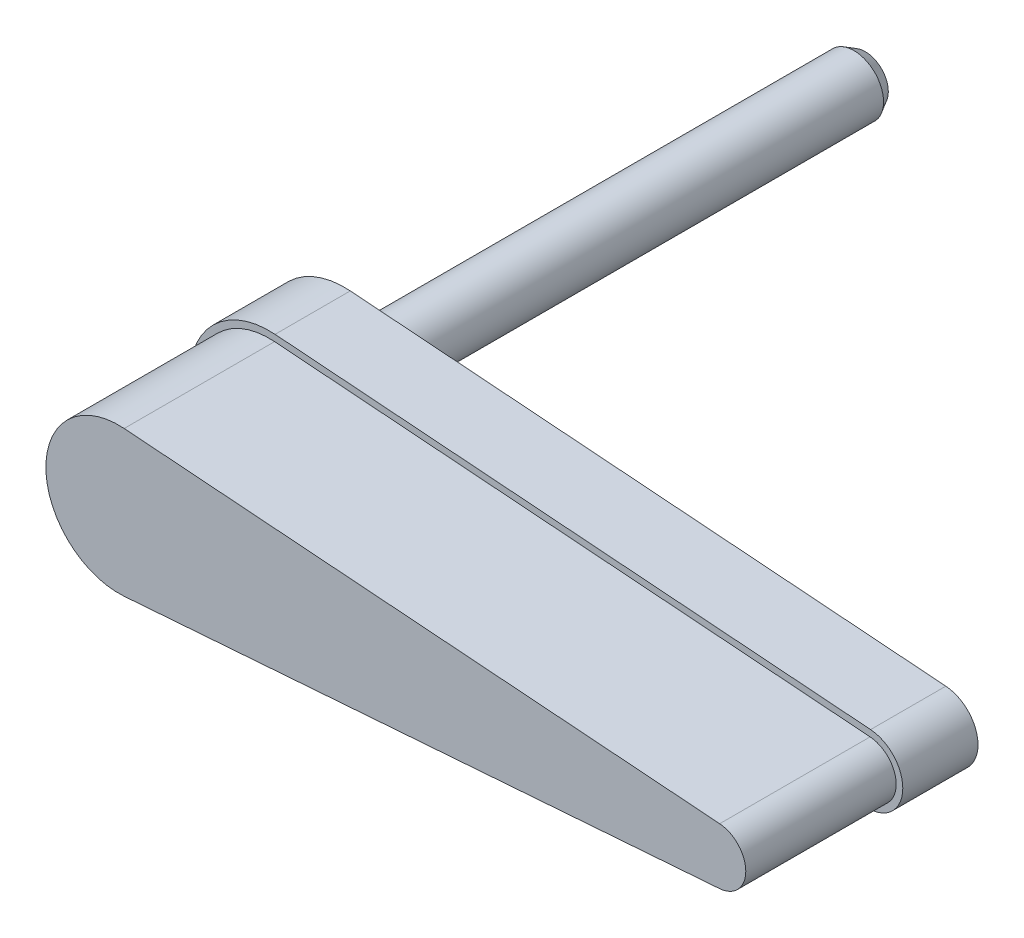
ISO-10303-21;
HEADER;
FILE_DESCRIPTION(('STEP AP214'),'2;1');
FILE_NAME('part.step','',(''),(''),'','','');
FILE_SCHEMA(('AUTOMOTIVE_DESIGN { 1 0 10303 214 1 1 1 1 }'));
ENDSEC;
DATA;
#1=APPLICATION_CONTEXT('core data for automotive mechanical design processes');
#2=APPLICATION_PROTOCOL_DEFINITION('international standard','automotive_design',2000,#1);
#3=PRODUCT_CONTEXT('',#1,'mechanical');
#4=PRODUCT('Part','Part','',(#3));
#5=PRODUCT_RELATED_PRODUCT_CATEGORY('part','',(#4));
#6=PRODUCT_DEFINITION_FORMATION('','',#4);
#7=PRODUCT_DEFINITION_CONTEXT('part definition',#1,'design');
#8=PRODUCT_DEFINITION('design','',#6,#7);
#9=PRODUCT_DEFINITION_SHAPE('','',#8);
#10=(LENGTH_UNIT() NAMED_UNIT(*) SI_UNIT(.MILLI.,.METRE.));
#11=(NAMED_UNIT(*) PLANE_ANGLE_UNIT() SI_UNIT($,.RADIAN.));
#12=(NAMED_UNIT(*) SI_UNIT($,.STERADIAN.) SOLID_ANGLE_UNIT());
#13=UNCERTAINTY_MEASURE_WITH_UNIT(LENGTH_MEASURE(1.E-05),#10,'distance_accuracy_value','');
#14=(GEOMETRIC_REPRESENTATION_CONTEXT(3) GLOBAL_UNCERTAINTY_ASSIGNED_CONTEXT((#13)) GLOBAL_UNIT_ASSIGNED_CONTEXT((#10,
#11,#12)) REPRESENTATION_CONTEXT('',''));
#15=CARTESIAN_POINT('',(0.,0.,0.));
#16=DIRECTION('',(0.,0.,1.));
#17=DIRECTION('',(1.,0.,0.));
#18=AXIS2_PLACEMENT_3D('',#15,#16,#17);
#19=CARTESIAN_POINT('',(0.577940530017583,-7.72842058533068,24.));
#20=DIRECTION('',(-0.074572971615172,0.997215559397507,0.));
#21=DIRECTION('',(-0.997215559397507,-0.0745729716151721,0.));
#22=AXIS2_PLACEMENT_3D('',#19,#20,#21);
#23=PLANE('',#22);
#24=DIRECTION('',(0.,0.,-1.));
#25=VECTOR('',#24,1.);
#26=CARTESIAN_POINT('',(0.577940530017583,-7.72842058533068,24.));
#27=LINE('',#26,#25);
#28=CARTESIAN_POINT('',(0.577940530017583,-7.72842058533068,24.));
#29=VERTEX_POINT('',#28);
#30=CARTESIAN_POINT('',(0.577940530017583,-7.72842058533068,8.));
#31=VERTEX_POINT('',#30);
#32=EDGE_CURVE('E114',#29,#31,#27,.T.);
#33=ORIENTED_EDGE('',*,*,#32,.T.);
#34=DIRECTION('',(0.997215559397507,0.0745729716151721,0.));
#35=VECTOR('',#34,1.);
#36=CARTESIAN_POINT('',(0.577940530017583,-7.72842058533068,8.));
#37=LINE('',#36,#35);
#38=CARTESIAN_POINT('',(63.9197189148455,-2.99164667819252,8.));
#39=VERTEX_POINT('',#38);
#40=EDGE_CURVE('E50',#31,#39,#37,.T.);
#41=ORIENTED_EDGE('',*,*,#40,.T.);
#42=DIRECTION('',(0.,0.,-1.));
#43=VECTOR('',#42,1.);
#44=CARTESIAN_POINT('',(63.9197189148455,-2.99164667819252,24.));
#45=LINE('',#44,#43);
#46=CARTESIAN_POINT('',(63.9197189148455,-2.99164667819252,24.));
#47=VERTEX_POINT('',#46);
#48=EDGE_CURVE('E113',#47,#39,#45,.T.);
#49=ORIENTED_EDGE('',*,*,#48,.F.);
#50=DIRECTION('',(0.997215559397507,0.0745729716151721,0.));
#51=VECTOR('',#50,1.);
#52=CARTESIAN_POINT('',(0.577940530017583,-7.72842058533068,24.));
#53=LINE('',#52,#51);
#54=EDGE_CURVE('E218',#29,#47,#53,.T.);
#55=ORIENTED_EDGE('',*,*,#54,.F.);
#56=EDGE_LOOP('',(#33,#41,#49,#55));
#57=FACE_BOUND('',#56,.T.);
#58=ADVANCED_FACE('F35',(#57),#23,.F.);
#59=CARTESIAN_POINT('',(63.696,0.,24.));
#60=DIRECTION('',(0.,0.,-1.));
#61=DIRECTION('',(-1.,0.,0.));
#62=AXIS2_PLACEMENT_3D('',#59,#60,#61);
#63=CYLINDRICAL_SURFACE('',#62,3.);
#64=ORIENTED_EDGE('',*,*,#48,.T.);
#65=CARTESIAN_POINT('',(63.696,0.,8.));
#66=DIRECTION('',(0.,0.,1.));
#67=DIRECTION('',(1.,0.,0.));
#68=AXIS2_PLACEMENT_3D('',#65,#66,#67);
#69=CIRCLE('',#68,3.);
#70=CARTESIAN_POINT('',(63.9197189148455,2.99164667819252,8.));
#71=VERTEX_POINT('',#70);
#72=EDGE_CURVE('E100',#39,#71,#69,.T.);
#73=ORIENTED_EDGE('',*,*,#72,.T.);
#74=DIRECTION('',(0.,0.,-1.));
#75=VECTOR('',#74,1.);
#76=CARTESIAN_POINT('',(63.9197189148455,2.99164667819252,24.));
#77=LINE('',#76,#75);
#78=CARTESIAN_POINT('',(63.9197189148455,2.99164667819252,24.));
#79=VERTEX_POINT('',#78);
#80=EDGE_CURVE('E120',#79,#71,#77,.T.);
#81=ORIENTED_EDGE('',*,*,#80,.F.);
#82=CARTESIAN_POINT('',(63.696,0.,24.));
#83=DIRECTION('',(0.,0.,1.));
#84=DIRECTION('',(1.,0.,0.));
#85=AXIS2_PLACEMENT_3D('',#82,#83,#84);
#86=CIRCLE('',#85,3.);
#87=EDGE_CURVE('E118',#47,#79,#86,.T.);
#88=ORIENTED_EDGE('',*,*,#87,.F.);
#89=EDGE_LOOP('',(#64,#73,#81,#88));
#90=FACE_BOUND('',#89,.T.);
#91=ADVANCED_FACE('F117',(#90),#63,.T.);
#92=CARTESIAN_POINT('',(0.577940530017583,7.72842058533068,24.));
#93=DIRECTION('',(0.074572971615172,0.997215559397507,0.));
#94=DIRECTION('',(-0.997215559397507,0.0745729716151721,0.));
#95=AXIS2_PLACEMENT_3D('',#92,#93,#94);
#96=PLANE('',#95);
#97=DIRECTION('',(-0.997215559397507,0.0745729716151721,0.));
#98=VECTOR('',#97,1.);
#99=CARTESIAN_POINT('',(63.9197189148455,2.99164667819252,8.));
#100=LINE('',#99,#98);
#101=CARTESIAN_POINT('',(0.577940530017583,7.72842058533068,8.));
#102=VERTEX_POINT('',#101);
#103=EDGE_CURVE('E103',#71,#102,#100,.T.);
#104=ORIENTED_EDGE('',*,*,#103,.T.);
#105=DIRECTION('',(0.,0.,-1.));
#106=VECTOR('',#105,1.);
#107=CARTESIAN_POINT('',(0.577940530017583,7.72842058533068,24.));
#108=LINE('',#107,#106);
#109=CARTESIAN_POINT('',(0.577940530017583,7.72842058533068,24.));
#110=VERTEX_POINT('',#109);
#111=EDGE_CURVE('E124',#110,#102,#108,.T.);
#112=ORIENTED_EDGE('',*,*,#111,.F.);
#113=DIRECTION('',(0.997215559397507,-0.0745729716151721,0.));
#114=VECTOR('',#113,1.);
#115=CARTESIAN_POINT('',(0.577940530017583,7.72842058533068,24.));
#116=LINE('',#115,#114);
#117=EDGE_CURVE('E221',#110,#79,#116,.T.);
#118=ORIENTED_EDGE('',*,*,#117,.T.);
#119=ORIENTED_EDGE('',*,*,#80,.T.);
#120=EDGE_LOOP('',(#104,#112,#118,#119));
#121=FACE_BOUND('',#120,.T.);
#122=ADVANCED_FACE('F144',(#121),#96,.T.);
#123=CARTESIAN_POINT('',(0.,0.,24.));
#124=DIRECTION('',(0.,0.,-1.));
#125=DIRECTION('',(-1.,0.,0.));
#126=AXIS2_PLACEMENT_3D('',#123,#124,#125);
#127=CYLINDRICAL_SURFACE('',#126,7.75);
#128=ORIENTED_EDGE('',*,*,#111,.T.);
#129=CARTESIAN_POINT('',(0.,0.,8.));
#130=DIRECTION('',(0.,0.,1.));
#131=DIRECTION('',(1.,0.,0.));
#132=AXIS2_PLACEMENT_3D('',#129,#130,#131);
#133=CIRCLE('',#132,7.75);
#134=EDGE_CURVE('E115',#102,#31,#133,.T.);
#135=ORIENTED_EDGE('',*,*,#134,.T.);
#136=ORIENTED_EDGE('',*,*,#32,.F.);
#137=CARTESIAN_POINT('',(0.,0.,24.));
#138=DIRECTION('',(0.,0.,1.));
#139=DIRECTION('',(1.,0.,0.));
#140=AXIS2_PLACEMENT_3D('',#137,#138,#139);
#141=CIRCLE('',#140,7.75);
#142=EDGE_CURVE('E58',#110,#29,#141,.T.);
#143=ORIENTED_EDGE('',*,*,#142,.F.);
#144=EDGE_LOOP('',(#128,#135,#136,#143));
#145=FACE_BOUND('',#144,.T.);
#146=ADVANCED_FACE('F149',(#145),#127,.T.);
#147=CARTESIAN_POINT('',(0.,0.,24.));
#148=DIRECTION('',(0.,0.,1.));
#149=DIRECTION('',(1.,0.,0.));
#150=AXIS2_PLACEMENT_3D('',#147,#148,#149);
#151=PLANE('',#150);
#152=ORIENTED_EDGE('',*,*,#54,.T.);
#153=ORIENTED_EDGE('',*,*,#87,.T.);
#154=ORIENTED_EDGE('',*,*,#117,.F.);
#155=ORIENTED_EDGE('',*,*,#142,.T.);
#156=EDGE_LOOP('',(#152,#153,#154,#155));
#157=FACE_BOUND('',#156,.T.);
#158=ADVANCED_FACE('F153',(#157),#151,.T.);
#159=CARTESIAN_POINT('',(0.,0.,8.));
#160=DIRECTION('',(0.,0.,1.));
#161=DIRECTION('',(1.,0.,0.));
#162=AXIS2_PLACEMENT_3D('',#159,#160,#161);
#163=PLANE('',#162);
#164=CARTESIAN_POINT('',(0.,0.,8.));
#165=DIRECTION('',(0.,0.,1.));
#166=DIRECTION('',(1.,0.,0.));
#167=AXIS2_PLACEMENT_3D('',#164,#165,#166);
#168=CIRCLE('',#167,8.45);
#169=CARTESIAN_POINT('',(0.630141610148203,8.42647147690893,8.));
#170=VERTEX_POINT('',#169);
#171=CARTESIAN_POINT('',(0.630141610148199,-8.42647147690893,8.));
#172=VERTEX_POINT('',#171);
#173=EDGE_CURVE('E207',#170,#172,#168,.T.);
#174=ORIENTED_EDGE('',*,*,#173,.T.);
#175=DIRECTION('',(0.997215559397507,0.074572971615172,0.));
#176=VECTOR('',#175,1.);
#177=CARTESIAN_POINT('',(0.630141610148199,-8.42647147690893,8.));
#178=LINE('',#177,#176);
#179=CARTESIAN_POINT('',(63.9719199949762,-3.68969756977078,8.));
#180=VERTEX_POINT('',#179);
#181=EDGE_CURVE('E230',#172,#180,#178,.T.);
#182=ORIENTED_EDGE('',*,*,#181,.T.);
#183=CARTESIAN_POINT('',(63.696,0.,8.));
#184=DIRECTION('',(0.,0.,1.));
#185=DIRECTION('',(1.,0.,0.));
#186=AXIS2_PLACEMENT_3D('',#183,#184,#185);
#187=CIRCLE('',#186,3.7);
#188=CARTESIAN_POINT('',(63.9719199949761,3.68969756977078,8.));
#189=VERTEX_POINT('',#188);
#190=EDGE_CURVE('E231',#180,#189,#187,.T.);
#191=ORIENTED_EDGE('',*,*,#190,.T.);
#192=DIRECTION('',(-0.997215559397507,0.074572971615172,0.));
#193=VECTOR('',#192,1.);
#194=CARTESIAN_POINT('',(63.9719199949761,3.68969756977078,8.));
#195=LINE('',#194,#193);
#196=EDGE_CURVE('E202',#189,#170,#195,.T.);
#197=ORIENTED_EDGE('',*,*,#196,.T.);
#198=EDGE_LOOP('',(#174,#182,#191,#197));
#199=FACE_BOUND('',#198,.T.);
#200=ORIENTED_EDGE('',*,*,#40,.F.);
#201=ORIENTED_EDGE('',*,*,#134,.F.);
#202=ORIENTED_EDGE('',*,*,#103,.F.);
#203=ORIENTED_EDGE('',*,*,#72,.F.);
#204=EDGE_LOOP('',(#200,#201,#202,#203));
#205=FACE_BOUND('',#204,.T.);
#206=ADVANCED_FACE('F101',(#199,#205),#163,.T.);
#207=CARTESIAN_POINT('',(0.,0.,8.));
#208=DIRECTION('',(0.,0.,-1.));
#209=DIRECTION('',(-1.,0.,0.));
#210=AXIS2_PLACEMENT_3D('',#207,#208,#209);
#211=CYLINDRICAL_SURFACE('',#210,8.45);
#212=CARTESIAN_POINT('',(0.,0.,0.));
#213=DIRECTION('',(0.,0.,1.));
#214=DIRECTION('',(1.,0.,0.));
#215=AXIS2_PLACEMENT_3D('',#212,#213,#214);
#216=CIRCLE('',#215,8.45);
#217=CARTESIAN_POINT('',(0.630141610148203,8.42647147690893,0.));
#218=VERTEX_POINT('',#217);
#219=CARTESIAN_POINT('',(0.630141610148199,-8.42647147690893,0.));
#220=VERTEX_POINT('',#219);
#221=EDGE_CURVE('E190',#218,#220,#216,.T.);
#222=ORIENTED_EDGE('',*,*,#221,.T.);
#223=DIRECTION('',(0.,0.,-1.));
#224=VECTOR('',#223,1.);
#225=CARTESIAN_POINT('',(0.630141610148199,-8.42647147690893,8.));
#226=LINE('',#225,#224);
#227=EDGE_CURVE('E216',#172,#220,#226,.T.);
#228=ORIENTED_EDGE('',*,*,#227,.F.);
#229=ORIENTED_EDGE('',*,*,#173,.F.);
#230=DIRECTION('',(0.,0.,-1.));
#231=VECTOR('',#230,1.);
#232=CARTESIAN_POINT('',(0.630141610148203,8.42647147690893,8.));
#233=LINE('',#232,#231);
#234=EDGE_CURVE('E208',#170,#218,#233,.T.);
#235=ORIENTED_EDGE('',*,*,#234,.T.);
#236=EDGE_LOOP('',(#222,#228,#229,#235));
#237=FACE_BOUND('',#236,.T.);
#238=ADVANCED_FACE('F162',(#237),#211,.T.);
#239=CARTESIAN_POINT('',(0.630141610148199,-8.42647147690893,8.));
#240=DIRECTION('',(-0.074572971615172,0.997215559397507,0.));
#241=DIRECTION('',(-0.997215559397507,-0.074572971615172,0.));
#242=AXIS2_PLACEMENT_3D('',#239,#240,#241);
#243=PLANE('',#242);
#244=DIRECTION('',(0.997215559397507,0.074572971615172,0.));
#245=VECTOR('',#244,1.);
#246=CARTESIAN_POINT('',(0.630141610148199,-8.42647147690893,0.));
#247=LINE('',#246,#245);
#248=CARTESIAN_POINT('',(63.9719199949762,-3.68969756977078,0.));
#249=VERTEX_POINT('',#248);
#250=EDGE_CURVE('E193',#220,#249,#247,.T.);
#251=ORIENTED_EDGE('',*,*,#250,.T.);
#252=DIRECTION('',(0.,0.,-1.));
#253=VECTOR('',#252,1.);
#254=CARTESIAN_POINT('',(63.9719199949762,-3.68969756977078,8.));
#255=LINE('',#254,#253);
#256=EDGE_CURVE('E213',#180,#249,#255,.T.);
#257=ORIENTED_EDGE('',*,*,#256,.F.);
#258=ORIENTED_EDGE('',*,*,#181,.F.);
#259=ORIENTED_EDGE('',*,*,#227,.T.);
#260=EDGE_LOOP('',(#251,#257,#258,#259));
#261=FACE_BOUND('',#260,.T.);
#262=ADVANCED_FACE('F165',(#261),#243,.F.);
#263=CARTESIAN_POINT('',(63.696,0.,8.));
#264=DIRECTION('',(0.,0.,-1.));
#265=DIRECTION('',(-1.,0.,0.));
#266=AXIS2_PLACEMENT_3D('',#263,#264,#265);
#267=CYLINDRICAL_SURFACE('',#266,3.7);
#268=CARTESIAN_POINT('',(63.696,0.,0.));
#269=DIRECTION('',(0.,0.,1.));
#270=DIRECTION('',(1.,0.,0.));
#271=AXIS2_PLACEMENT_3D('',#268,#269,#270);
#272=CIRCLE('',#271,3.7);
#273=CARTESIAN_POINT('',(63.9719199949761,3.68969756977078,0.));
#274=VERTEX_POINT('',#273);
#275=EDGE_CURVE('E198',#249,#274,#272,.T.);
#276=ORIENTED_EDGE('',*,*,#275,.T.);
#277=DIRECTION('',(0.,0.,-1.));
#278=VECTOR('',#277,1.);
#279=CARTESIAN_POINT('',(63.9719199949761,3.68969756977078,8.));
#280=LINE('',#279,#278);
#281=EDGE_CURVE('E210',#189,#274,#280,.T.);
#282=ORIENTED_EDGE('',*,*,#281,.F.);
#283=ORIENTED_EDGE('',*,*,#190,.F.);
#284=ORIENTED_EDGE('',*,*,#256,.T.);
#285=EDGE_LOOP('',(#276,#282,#283,#284));
#286=FACE_BOUND('',#285,.T.);
#287=ADVANCED_FACE('F169',(#286),#267,.T.);
#288=CARTESIAN_POINT('',(63.9719199949761,3.68969756977078,8.));
#289=DIRECTION('',(-0.074572971615172,-0.997215559397507,0.));
#290=DIRECTION('',(0.997215559397507,-0.074572971615172,0.));
#291=AXIS2_PLACEMENT_3D('',#288,#289,#290);
#292=PLANE('',#291);
#293=DIRECTION('',(-0.997215559397507,0.074572971615172,0.));
#294=VECTOR('',#293,1.);
#295=CARTESIAN_POINT('',(63.9719199949761,3.68969756977078,0.));
#296=LINE('',#295,#294);
#297=EDGE_CURVE('E192',#274,#218,#296,.T.);
#298=ORIENTED_EDGE('',*,*,#297,.T.);
#299=ORIENTED_EDGE('',*,*,#234,.F.);
#300=ORIENTED_EDGE('',*,*,#196,.F.);
#301=ORIENTED_EDGE('',*,*,#281,.T.);
#302=EDGE_LOOP('',(#298,#299,#300,#301));
#303=FACE_BOUND('',#302,.T.);
#304=ADVANCED_FACE('F158',(#303),#292,.F.);
#305=CARTESIAN_POINT('',(0.,0.,0.));
#306=DIRECTION('',(0.,0.,1.));
#307=DIRECTION('',(1.,0.,0.));
#308=AXIS2_PLACEMENT_3D('',#305,#306,#307);
#309=PLANE('',#308);
#310=CARTESIAN_POINT('',(0.,0.,0.));
#311=DIRECTION('',(0.,0.,1.));
#312=DIRECTION('',(1.,0.,0.));
#313=AXIS2_PLACEMENT_3D('',#310,#311,#312);
#314=CIRCLE('',#313,3.15);
#315=CARTESIAN_POINT('',(3.15,0.,0.));
#316=VERTEX_POINT('',#315);
#317=EDGE_CURVE('E119',#316,#316,#314,.F.);
#318=ORIENTED_EDGE('',*,*,#317,.F.);
#319=EDGE_LOOP('',(#318));
#320=FACE_BOUND('',#319,.T.);
#321=ORIENTED_EDGE('',*,*,#221,.F.);
#322=ORIENTED_EDGE('',*,*,#297,.F.);
#323=ORIENTED_EDGE('',*,*,#275,.F.);
#324=ORIENTED_EDGE('',*,*,#250,.F.);
#325=EDGE_LOOP('',(#321,#322,#323,#324));
#326=FACE_BOUND('',#325,.T.);
#327=ADVANCED_FACE('F155',(#320,#326),#309,.F.);
#328=CARTESIAN_POINT('',(0.,0.,-55.4));
#329=DIRECTION('',(0.,0.,1.));
#330=DIRECTION('',(1.,0.,0.));
#331=AXIS2_PLACEMENT_3D('',#328,#329,#330);
#332=CYLINDRICAL_SURFACE('',#331,3.15);
#333=CARTESIAN_POINT('',(0.,0.,-54.2));
#334=DIRECTION('',(0.,0.,-1.));
#335=DIRECTION('',(-1.,0.,0.));
#336=AXIS2_PLACEMENT_3D('',#333,#334,#335);
#337=CIRCLE('',#336,3.15);
#338=CARTESIAN_POINT('',(3.15,0.,-54.2));
#339=VERTEX_POINT('',#338);
#340=EDGE_CURVE('E11',#339,#339,#337,.F.);
#341=ORIENTED_EDGE('',*,*,#340,.T.);
#342=EDGE_LOOP('',(#341));
#343=FACE_BOUND('',#342,.T.);
#344=ORIENTED_EDGE('',*,*,#317,.T.);
#345=EDGE_LOOP('',(#344));
#346=FACE_BOUND('',#345,.T.);
#347=ADVANCED_FACE('F137',(#343,#346),#332,.T.);
#348=CARTESIAN_POINT('',(0.,0.,-55.4));
#349=DIRECTION('',(0.,0.,-1.));
#350=DIRECTION('',(-1.,0.,0.));
#351=AXIS2_PLACEMENT_3D('',#348,#349,#350);
#352=PLANE('',#351);
#353=CARTESIAN_POINT('',(0.,0.,-55.4));
#354=DIRECTION('',(0.,0.,-1.));
#355=DIRECTION('',(-1.,0.,0.));
#356=AXIS2_PLACEMENT_3D('',#353,#354,#355);
#357=CIRCLE('',#356,2.45717967697244);
#358=CARTESIAN_POINT('',(2.45717967697244,0.,-55.4));
#359=VERTEX_POINT('',#358);
#360=EDGE_CURVE('E43',#359,#359,#357,.T.);
#361=ORIENTED_EDGE('',*,*,#360,.T.);
#362=EDGE_LOOP('',(#361));
#363=FACE_BOUND('',#362,.T.);
#364=ADVANCED_FACE('F130',(#363),#352,.T.);
#365=CARTESIAN_POINT('',(0.,0.,-55.4));
#366=DIRECTION('',(0.,0.,1.));
#367=DIRECTION('',(1.,0.,0.));
#368=AXIS2_PLACEMENT_3D('',#365,#366,#367);
#369=CONICAL_SURFACE('',#368,2.45717967697244,0.523598775598297);
#370=CARTESIAN_POINT('',(3.15,0.,-54.2));
#371=CARTESIAN_POINT('',(3.14278312163513,0.,-54.2125));
#372=CARTESIAN_POINT('',(3.13556624327026,0.,-54.225));
#373=CARTESIAN_POINT('',(3.12113248654052,0.,-54.25));
#374=CARTESIAN_POINT('',(3.11391560817565,0.,-54.2625));
#375=CARTESIAN_POINT('',(3.09948185144591,0.,-54.2875));
#376=CARTESIAN_POINT('',(3.09226497308104,0.,-54.3));
#377=CARTESIAN_POINT('',(3.0778312163513,0.,-54.325));
#378=CARTESIAN_POINT('',(3.07061433798643,0.,-54.3375));
#379=CARTESIAN_POINT('',(3.05618058125669,0.,-54.3625));
#380=CARTESIAN_POINT('',(3.04896370289182,0.,-54.375));
#381=CARTESIAN_POINT('',(3.03452994616208,0.,-54.4));
#382=CARTESIAN_POINT('',(3.02731306779721,0.,-54.4125));
#383=CARTESIAN_POINT('',(3.01287931106746,0.,-54.4375));
#384=CARTESIAN_POINT('',(3.00566243270259,0.,-54.45));
#385=CARTESIAN_POINT('',(2.99122867597285,0.,-54.475));
#386=CARTESIAN_POINT('',(2.98401179760798,0.,-54.4875));
#387=CARTESIAN_POINT('',(2.96957804087824,0.,-54.5125));
#388=CARTESIAN_POINT('',(2.96236116251337,0.,-54.525));
#389=CARTESIAN_POINT('',(2.94792740578363,0.,-54.55));
#390=CARTESIAN_POINT('',(2.94071052741876,0.,-54.5625));
#391=CARTESIAN_POINT('',(2.92627677068902,0.,-54.5875));
#392=CARTESIAN_POINT('',(2.91905989232415,0.,-54.6));
#393=CARTESIAN_POINT('',(2.90462613559441,0.,-54.625));
#394=CARTESIAN_POINT('',(2.89740925722954,0.,-54.6375));
#395=CARTESIAN_POINT('',(2.8829755004998,0.,-54.6625));
#396=CARTESIAN_POINT('',(2.87575862213493,0.,-54.675));
#397=CARTESIAN_POINT('',(2.86132486540519,0.,-54.7));
#398=CARTESIAN_POINT('',(2.85410798704032,0.,-54.7125));
#399=CARTESIAN_POINT('',(2.83967423031057,0.,-54.7375));
#400=CARTESIAN_POINT('',(2.8324573519457,0.,-54.75));
#401=CARTESIAN_POINT('',(2.81802359521596,0.,-54.775));
#402=CARTESIAN_POINT('',(2.81080671685109,0.,-54.7875));
#403=CARTESIAN_POINT('',(2.79637296012135,0.,-54.8125));
#404=CARTESIAN_POINT('',(2.78915608175648,0.,-54.825));
#405=CARTESIAN_POINT('',(2.77472232502674,0.,-54.85));
#406=CARTESIAN_POINT('',(2.76750544666187,0.,-54.8625));
#407=CARTESIAN_POINT('',(2.75307168993213,0.,-54.8875));
#408=CARTESIAN_POINT('',(2.74585481156726,0.,-54.9));
#409=CARTESIAN_POINT('',(2.73142105483752,0.,-54.925));
#410=CARTESIAN_POINT('',(2.72420417647265,0.,-54.9375));
#411=CARTESIAN_POINT('',(2.70977041974291,0.,-54.9625));
#412=CARTESIAN_POINT('',(2.70255354137804,0.,-54.975));
#413=CARTESIAN_POINT('',(2.6881197846483,0.,-55.));
#414=CARTESIAN_POINT('',(2.68090290628343,0.,-55.0125));
#415=CARTESIAN_POINT('',(2.66646914955368,0.,-55.0375));
#416=CARTESIAN_POINT('',(2.65925227118881,0.,-55.05));
#417=CARTESIAN_POINT('',(2.64481851445907,0.,-55.075));
#418=CARTESIAN_POINT('',(2.6376016360942,0.,-55.0875));
#419=CARTESIAN_POINT('',(2.62316787936446,0.,-55.1125));
#420=CARTESIAN_POINT('',(2.61595100099959,0.,-55.125));
#421=CARTESIAN_POINT('',(2.60151724426985,0.,-55.15));
#422=CARTESIAN_POINT('',(2.59430036590498,0.,-55.1625));
#423=CARTESIAN_POINT('',(2.57986660917524,0.,-55.1875));
#424=CARTESIAN_POINT('',(2.57264973081037,0.,-55.2));
#425=CARTESIAN_POINT('',(2.55821597408063,0.,-55.225));
#426=CARTESIAN_POINT('',(2.55099909571576,0.,-55.2375));
#427=CARTESIAN_POINT('',(2.53656533898602,0.,-55.2625));
#428=CARTESIAN_POINT('',(2.52934846062115,0.,-55.275));
#429=CARTESIAN_POINT('',(2.51491470389141,0.,-55.3));
#430=CARTESIAN_POINT('',(2.50769782552654,0.,-55.3125));
#431=CARTESIAN_POINT('',(2.49326406879679,0.,-55.3375));
#432=CARTESIAN_POINT('',(2.48604719043192,0.,-55.35));
#433=CARTESIAN_POINT('',(2.47161343370218,0.,-55.375));
#434=CARTESIAN_POINT('',(2.46439655533731,0.,-55.3875));
#435=CARTESIAN_POINT('',(2.45717967697244,0.,-55.4));
#436=B_SPLINE_CURVE_WITH_KNOTS('',3,(#370,#371,#372,#373,#374,#375,#376,#377,#378,#379,#380,
#381,#382,#383,#384,#385,#386,#387,#388,#389,#390,#391,#392,#393,#394,#395,#396,#397,#398,#399,
#400,#401,#402,#403,#404,#405,#406,#407,#408,#409,#410,#411,#412,#413,#414,#415,#416,#417,#418,
#419,#420,#421,#422,#423,#424,#425,#426,#427,#428,#429,#430,#431,#432,#433,#434,#435),
.UNSPECIFIED.,.F.,.F.,(4,2,2,2,2,2,2,2,2,2,2,2,2,2,2,2,2,2,2,2,2,2,2,2,2,2,2,2,2,2,2,2,4),(0.,
0.0433012701892185,0.086602540378443,0.129903810567668,0.173205080756886,0.216506350946111,
0.259807621135335,0.303108891324554,0.346410161513778,0.389711431703003,0.433012701892221,
0.476313972081446,0.51961524227067,0.562916512459889,0.606217782649113,0.649519052838338,
0.692820323027562,0.736121593216781,0.779422863406005,0.82272413359523,0.866025403784448,
0.909326673973673,0.952627944162897,0.995929214352116,1.03923048454134,1.08253175473056,
1.12583302491978,1.16913429510901,1.21243556529823,1.25573683548745,1.29903810567668,
1.3423393758659,1.38564064605512),.UNSPECIFIED.);
#437=EDGE_CURVE('BSEAM37',#339,#359,#436,.T.);
#438=ORIENTED_EDGE('',*,*,#340,.F.);
#439=ORIENTED_EDGE('',*,*,#360,.F.);
#440=ORIENTED_EDGE('',*,*,#437,.T.);
#441=ORIENTED_EDGE('',*,*,#437,.F.);
#442=EDGE_LOOP('',(#438,#440,#439,#441));
#443=FACE_BOUND('',#442,.T.);
#444=ADVANCED_FACE('F37',(#443),#369,.T.);
#445=CLOSED_SHELL('',(#58,#91,#122,#146,#158,#206,#238,#262,#287,#304,#327,#347,#364,#444));
#446=MANIFOLD_SOLID_BREP('B2',#445);
#447=ADVANCED_BREP_SHAPE_REPRESENTATION('',(#18,#446),#14);
#448=SHAPE_DEFINITION_REPRESENTATION(#9,#447);
ENDSEC;
END-ISO-10303-21;
